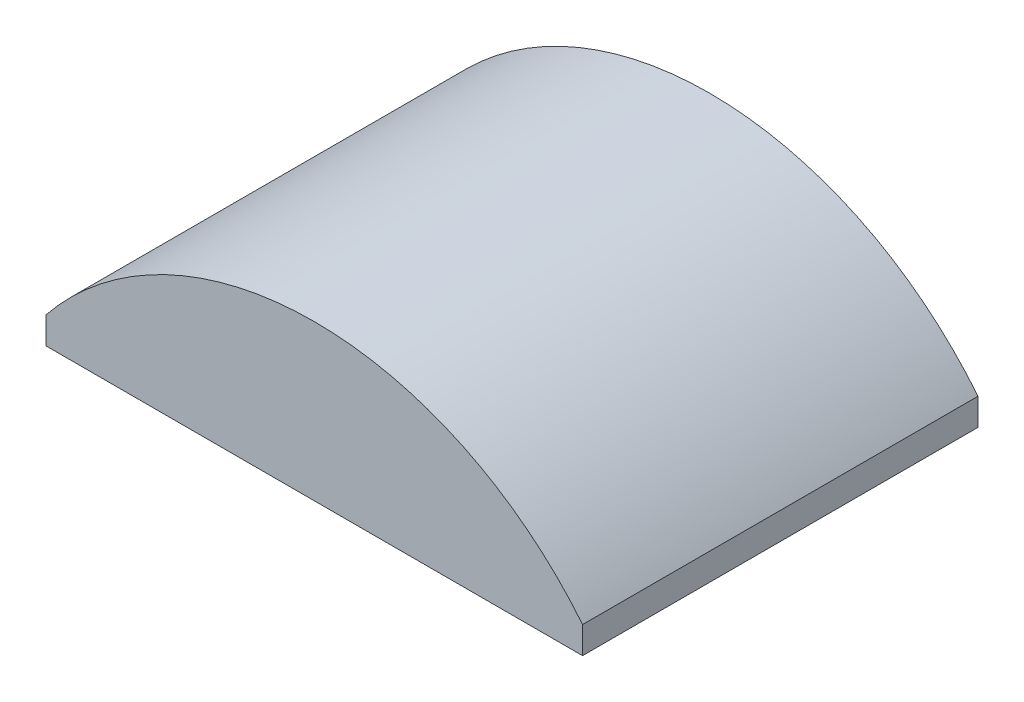
ISO-10303-21;
HEADER;
FILE_DESCRIPTION(('STEP AP214'),'2;1');
FILE_NAME('part.step','',(''),(''),'','','');
FILE_SCHEMA(('AUTOMOTIVE_DESIGN { 1 0 10303 214 1 1 1 1 }'));
ENDSEC;
DATA;
#1=APPLICATION_CONTEXT('core data for automotive mechanical design processes');
#2=APPLICATION_PROTOCOL_DEFINITION('international standard','automotive_design',2000,#1);
#3=PRODUCT_CONTEXT('',#1,'mechanical');
#4=PRODUCT('Part','Part','',(#3));
#5=PRODUCT_RELATED_PRODUCT_CATEGORY('part','',(#4));
#6=PRODUCT_DEFINITION_FORMATION('','',#4);
#7=PRODUCT_DEFINITION_CONTEXT('part definition',#1,'design');
#8=PRODUCT_DEFINITION('design','',#6,#7);
#9=PRODUCT_DEFINITION_SHAPE('','',#8);
#10=(LENGTH_UNIT() NAMED_UNIT(*) SI_UNIT(.MILLI.,.METRE.));
#11=(NAMED_UNIT(*) PLANE_ANGLE_UNIT() SI_UNIT($,.RADIAN.));
#12=(NAMED_UNIT(*) SI_UNIT($,.STERADIAN.) SOLID_ANGLE_UNIT());
#13=UNCERTAINTY_MEASURE_WITH_UNIT(LENGTH_MEASURE(1.E-05),#10,'distance_accuracy_value','');
#14=(GEOMETRIC_REPRESENTATION_CONTEXT(3) GLOBAL_UNCERTAINTY_ASSIGNED_CONTEXT((#13)) GLOBAL_UNIT_ASSIGNED_CONTEXT((#10,
#11,#12)) REPRESENTATION_CONTEXT('',''));
#15=CARTESIAN_POINT('',(0.,0.,0.));
#16=DIRECTION('',(0.,0.,1.));
#17=DIRECTION('',(1.,0.,0.));
#18=AXIS2_PLACEMENT_3D('',#15,#16,#17);
#19=CARTESIAN_POINT('',(8.83883476483183,-9.,30.8388347648319));
#20=DIRECTION('',(0.,-1.,0.));
#21=DIRECTION('',(1.,0.,0.));
#22=AXIS2_PLACEMENT_3D('',#19,#20,#21);
#23=PLANE('',#22);
#24=CARTESIAN_POINT('',(8.83883476483183,-9.,30.8388347648319));
#25=DIRECTION('',(0.,-1.,0.));
#26=DIRECTION('',(1.,0.,0.));
#27=AXIS2_PLACEMENT_3D('',#24,#25,#26);
#28=CIRCLE('',#27,3.5);
#29=CARTESIAN_POINT('',(12.3388347648318,-9.,30.8388347648319));
#30=VERTEX_POINT('',#29);
#31=EDGE_CURVE('E127',#30,#30,#28,.T.);
#32=ORIENTED_EDGE('',*,*,#31,.T.);
#33=EDGE_LOOP('',(#32));
#34=FACE_BOUND('',#33,.T.);
#35=CARTESIAN_POINT('',(8.83883476483183,-9.,30.8388347648319));
#36=DIRECTION('',(0.,-1.,0.));
#37=DIRECTION('',(1.,0.,0.));
#38=AXIS2_PLACEMENT_3D('',#35,#36,#37);
#39=CIRCLE('',#38,2.25);
#40=CARTESIAN_POINT('',(11.0888347648318,-9.,30.8388347648319));
#41=VERTEX_POINT('',#40);
#42=EDGE_CURVE('E320',#41,#41,#39,.T.);
#43=ORIENTED_EDGE('',*,*,#42,.F.);
#44=EDGE_LOOP('',(#43));
#45=FACE_BOUND('',#44,.T.);
#46=ADVANCED_FACE('F47',(#34,#45),#23,.T.);
#47=CARTESIAN_POINT('',(8.83883476483183,-9.,30.8388347648319));
#48=DIRECTION('',(0.,1.,0.));
#49=DIRECTION('',(-1.,0.,0.));
#50=AXIS2_PLACEMENT_3D('',#47,#48,#49);
#51=CYLINDRICAL_SURFACE('',#50,3.5);
#52=ORIENTED_EDGE('',*,*,#31,.F.);
#53=EDGE_LOOP('',(#52));
#54=FACE_BOUND('',#53,.T.);
#55=CARTESIAN_POINT('',(8.83883476483182,8.,30.8388347648319));
#56=DIRECTION('',(0.,-1.,0.));
#57=DIRECTION('',(1.,0.,0.));
#58=AXIS2_PLACEMENT_3D('',#55,#56,#57);
#59=CIRCLE('',#58,3.5);
#60=CARTESIAN_POINT('',(12.3388347648318,8.,30.8388347648319));
#61=VERTEX_POINT('',#60);
#62=EDGE_CURVE('E255',#61,#61,#59,.F.);
#63=ORIENTED_EDGE('',*,*,#62,.F.);
#64=EDGE_LOOP('',(#63));
#65=FACE_BOUND('',#64,.T.);
#66=ADVANCED_FACE('F185',(#54,#65),#51,.T.);
#67=CARTESIAN_POINT('',(8.83883476483183,-9.,30.8388347648319));
#68=DIRECTION('',(0.,1.,0.));
#69=DIRECTION('',(-1.,0.,0.));
#70=AXIS2_PLACEMENT_3D('',#67,#68,#69);
#71=CYLINDRICAL_SURFACE('',#70,2.25);
#72=ORIENTED_EDGE('',*,*,#42,.T.);
#73=EDGE_LOOP('',(#72));
#74=FACE_BOUND('',#73,.T.);
#75=CARTESIAN_POINT('',(8.83883476483183,0.,30.8388347648319));
#76=DIRECTION('',(0.,-1.,0.));
#77=DIRECTION('',(1.,0.,0.));
#78=AXIS2_PLACEMENT_3D('',#75,#76,#77);
#79=CIRCLE('',#78,2.25);
#80=CARTESIAN_POINT('',(11.0888347648318,0.,30.8388347648319));
#81=VERTEX_POINT('',#80);
#82=EDGE_CURVE('E294',#81,#81,#79,.T.);
#83=ORIENTED_EDGE('',*,*,#82,.F.);
#84=EDGE_LOOP('',(#83));
#85=FACE_BOUND('',#84,.T.);
#86=ADVANCED_FACE('F193',(#74,#85),#71,.F.);
#87=CARTESIAN_POINT('',(0.,0.,44.));
#88=DIRECTION('',(0.,1.,0.));
#89=DIRECTION('',(-1.,0.,0.));
#90=AXIS2_PLACEMENT_3D('',#87,#88,#89);
#91=PLANE('',#90);
#92=ORIENTED_EDGE('',*,*,#82,.T.);
#93=EDGE_LOOP('',(#92));
#94=FACE_BOUND('',#93,.T.);
#95=ADVANCED_FACE('F213',(#94),#91,.F.);
#96=CARTESIAN_POINT('',(8.83883476483182,8.,30.8388347648319));
#97=DIRECTION('',(0.,-1.,0.));
#98=DIRECTION('',(1.,0.,0.));
#99=AXIS2_PLACEMENT_3D('',#96,#97,#98);
#100=CYLINDRICAL_SURFACE('',#99,6.2);
#101=CARTESIAN_POINT('',(8.83883476483183,0.750000000000002,30.8388347648319));
#102=DIRECTION('',(0.,1.,0.));
#103=DIRECTION('',(0.,0.,1.));
#104=AXIS2_PLACEMENT_3D('',#101,#102,#103);
#105=CIRCLE('',#104,6.2);
#106=CARTESIAN_POINT('',(8.83883476483183,0.750000000000002,37.0388347648319));
#107=VERTEX_POINT('',#106);
#108=EDGE_CURVE('E160',#107,#107,#105,.F.);
#109=ORIENTED_EDGE('',*,*,#108,.T.);
#110=EDGE_LOOP('',(#109));
#111=FACE_BOUND('',#110,.T.);
#112=CARTESIAN_POINT('',(8.83883476483182,8.,30.8388347648319));
#113=DIRECTION('',(0.,-1.,0.));
#114=DIRECTION('',(1.,0.,0.));
#115=AXIS2_PLACEMENT_3D('',#112,#113,#114);
#116=CIRCLE('',#115,6.2);
#117=CARTESIAN_POINT('',(15.0388347648318,8.,30.8388347648319));
#118=VERTEX_POINT('',#117);
#119=EDGE_CURVE('E261',#118,#118,#116,.T.);
#120=ORIENTED_EDGE('',*,*,#119,.F.);
#121=EDGE_LOOP('',(#120));
#122=FACE_BOUND('',#121,.T.);
#123=ADVANCED_FACE('F333',(#111,#122),#100,.F.);
#124=CARTESIAN_POINT('',(0.,8.,0.));
#125=DIRECTION('',(0.,-1.,0.));
#126=DIRECTION('',(1.,0.,0.));
#127=AXIS2_PLACEMENT_3D('',#124,#125,#126);
#128=PLANE('',#127);
#129=ORIENTED_EDGE('',*,*,#62,.T.);
#130=EDGE_LOOP('',(#129));
#131=FACE_BOUND('',#130,.T.);
#132=ORIENTED_EDGE('',*,*,#119,.T.);
#133=EDGE_LOOP('',(#132));
#134=FACE_BOUND('',#133,.T.);
#135=ADVANCED_FACE('F219',(#131,#134),#128,.T.);
#136=CARTESIAN_POINT('',(0.,-21.0769599409892,44.));
#137=DIRECTION('',(0.,0.,-1.));
#138=DIRECTION('',(-1.,0.,0.));
#139=AXIS2_PLACEMENT_3D('',#136,#137,#138);
#140=CYLINDRICAL_SURFACE('',#139,38.35);
#141=CARTESIAN_POINT('',(0.,-21.0769599409892,0.));
#142=DIRECTION('',(0.,0.,1.));
#143=DIRECTION('',(1.,0.,0.));
#144=AXIS2_PLACEMENT_3D('',#141,#142,#143);
#145=CIRCLE('',#144,38.35);
#146=CARTESIAN_POINT('',(29.85,3.00000000000001,0.));
#147=VERTEX_POINT('',#146);
#148=CARTESIAN_POINT('',(-29.85,3.,0.));
#149=VERTEX_POINT('',#148);
#150=EDGE_CURVE('E123',#147,#149,#145,.T.);
#151=ORIENTED_EDGE('',*,*,#150,.T.);
#152=DIRECTION('',(0.,0.,-1.));
#153=VECTOR('',#152,1.);
#154=CARTESIAN_POINT('',(-29.85,3.,44.));
#155=LINE('',#154,#153);
#156=CARTESIAN_POINT('',(-29.85,3.,44.));
#157=VERTEX_POINT('',#156);
#158=EDGE_CURVE('E106',#157,#149,#155,.T.);
#159=ORIENTED_EDGE('',*,*,#158,.F.);
#160=CARTESIAN_POINT('',(0.,-21.0769599409892,44.));
#161=DIRECTION('',(0.,0.,1.));
#162=DIRECTION('',(1.,0.,0.));
#163=AXIS2_PLACEMENT_3D('',#160,#161,#162);
#164=CIRCLE('',#163,38.35);
#165=CARTESIAN_POINT('',(29.85,3.00000000000001,44.));
#166=VERTEX_POINT('',#165);
#167=EDGE_CURVE('E93',#166,#157,#164,.T.);
#168=ORIENTED_EDGE('',*,*,#167,.F.);
#169=DIRECTION('',(0.,0.,-1.));
#170=VECTOR('',#169,1.);
#171=CARTESIAN_POINT('',(29.85,3.00000000000001,44.));
#172=LINE('',#171,#170);
#173=EDGE_CURVE('E122',#166,#147,#172,.T.);
#174=ORIENTED_EDGE('',*,*,#173,.T.);
#175=EDGE_LOOP('',(#151,#159,#168,#174));
#176=FACE_BOUND('',#175,.T.);
#177=ADVANCED_FACE('F216',(#176),#140,.T.);
#178=CARTESIAN_POINT('',(-29.85,0.,44.));
#179=DIRECTION('',(-1.,0.,0.));
#180=DIRECTION('',(0.,0.,1.));
#181=AXIS2_PLACEMENT_3D('',#178,#179,#180);
#182=PLANE('',#181);
#183=DIRECTION('',(0.,1.,0.));
#184=VECTOR('',#183,1.);
#185=CARTESIAN_POINT('',(-29.85,0.,0.));
#186=LINE('',#185,#184);
#187=CARTESIAN_POINT('',(-29.85,0.,0.));
#188=VERTEX_POINT('',#187);
#189=EDGE_CURVE('E104',#188,#149,#186,.T.);
#190=ORIENTED_EDGE('',*,*,#189,.F.);
#191=DIRECTION('',(0.,0.,-1.));
#192=VECTOR('',#191,1.);
#193=CARTESIAN_POINT('',(-29.85,0.,44.));
#194=LINE('',#193,#192);
#195=CARTESIAN_POINT('',(-29.85,0.,44.));
#196=VERTEX_POINT('',#195);
#197=EDGE_CURVE('E99',#196,#188,#194,.T.);
#198=ORIENTED_EDGE('',*,*,#197,.F.);
#199=DIRECTION('',(0.,1.,0.));
#200=VECTOR('',#199,1.);
#201=CARTESIAN_POINT('',(-29.85,0.,44.));
#202=LINE('',#201,#200);
#203=EDGE_CURVE('E102',#196,#157,#202,.T.);
#204=ORIENTED_EDGE('',*,*,#203,.T.);
#205=ORIENTED_EDGE('',*,*,#158,.T.);
#206=EDGE_LOOP('',(#190,#198,#204,#205));
#207=FACE_BOUND('',#206,.T.);
#208=ADVANCED_FACE('F101',(#207),#182,.T.);
#209=CARTESIAN_POINT('',(0.,0.,44.));
#210=DIRECTION('',(0.,0.,1.));
#211=DIRECTION('',(1.,0.,0.));
#212=AXIS2_PLACEMENT_3D('',#209,#210,#211);
#213=PLANE('',#212);
#214=ORIENTED_EDGE('',*,*,#167,.T.);
#215=ORIENTED_EDGE('',*,*,#203,.F.);
#216=DIRECTION('',(1.,0.,0.));
#217=VECTOR('',#216,1.);
#218=CARTESIAN_POINT('',(0.,0.,44.));
#219=LINE('',#218,#217);
#220=CARTESIAN_POINT('',(29.85,0.,44.));
#221=VERTEX_POINT('',#220);
#222=EDGE_CURVE('E109',#196,#221,#219,.T.);
#223=ORIENTED_EDGE('',*,*,#222,.T.);
#224=DIRECTION('',(0.,1.,0.));
#225=VECTOR('',#224,1.);
#226=CARTESIAN_POINT('',(29.85,0.,44.));
#227=LINE('',#226,#225);
#228=EDGE_CURVE('E66',#221,#166,#227,.T.);
#229=ORIENTED_EDGE('',*,*,#228,.T.);
#230=EDGE_LOOP('',(#214,#215,#223,#229));
#231=FACE_BOUND('',#230,.T.);
#232=ADVANCED_FACE('F113',(#231),#213,.T.);
#233=CARTESIAN_POINT('',(29.85,0.,44.));
#234=DIRECTION('',(-1.,0.,0.));
#235=DIRECTION('',(0.,0.,1.));
#236=AXIS2_PLACEMENT_3D('',#233,#234,#235);
#237=PLANE('',#236);
#238=DIRECTION('',(0.,1.,0.));
#239=VECTOR('',#238,1.);
#240=CARTESIAN_POINT('',(29.85,0.,0.));
#241=LINE('',#240,#239);
#242=CARTESIAN_POINT('',(29.85,0.,0.));
#243=VERTEX_POINT('',#242);
#244=EDGE_CURVE('E88',#243,#147,#241,.T.);
#245=ORIENTED_EDGE('',*,*,#244,.T.);
#246=ORIENTED_EDGE('',*,*,#173,.F.);
#247=ORIENTED_EDGE('',*,*,#228,.F.);
#248=DIRECTION('',(0.,0.,-1.));
#249=VECTOR('',#248,1.);
#250=CARTESIAN_POINT('',(29.85,0.,44.));
#251=LINE('',#250,#249);
#252=EDGE_CURVE('E107',#221,#243,#251,.T.);
#253=ORIENTED_EDGE('',*,*,#252,.T.);
#254=EDGE_LOOP('',(#245,#246,#247,#253));
#255=FACE_BOUND('',#254,.T.);
#256=ADVANCED_FACE('F203',(#255),#237,.F.);
#257=CARTESIAN_POINT('',(0.,0.,0.));
#258=DIRECTION('',(0.,0.,1.));
#259=DIRECTION('',(1.,0.,0.));
#260=AXIS2_PLACEMENT_3D('',#257,#258,#259);
#261=PLANE('',#260);
#262=ORIENTED_EDGE('',*,*,#150,.F.);
#263=ORIENTED_EDGE('',*,*,#244,.F.);
#264=DIRECTION('',(1.,0.,0.));
#265=VECTOR('',#264,1.);
#266=CARTESIAN_POINT('',(0.,0.,0.));
#267=LINE('',#266,#265);
#268=EDGE_CURVE('E82',#188,#243,#267,.T.);
#269=ORIENTED_EDGE('',*,*,#268,.F.);
#270=ORIENTED_EDGE('',*,*,#189,.T.);
#271=EDGE_LOOP('',(#262,#263,#269,#270));
#272=FACE_BOUND('',#271,.T.);
#273=ADVANCED_FACE('F204',(#272),#261,.F.);
#274=CARTESIAN_POINT('',(8.83883476483186,0.,13.1611652351682));
#275=DIRECTION('',(0.,1.,0.));
#276=DIRECTION('',(-1.,0.,0.));
#277=AXIS2_PLACEMENT_3D('',#274,#275,#276);
#278=CIRCLE('',#277,6.94999999999998);
#279=CARTESIAN_POINT('',(1.88883476483188,0.,13.1611652351682));
#280=VERTEX_POINT('',#279);
#281=EDGE_CURVE('E156',#280,#280,#278,.T.);
#282=ORIENTED_EDGE('',*,*,#281,.T.);
#283=EDGE_LOOP('',(#282));
#284=FACE_BOUND('',#283,.T.);
#285=CARTESIAN_POINT('',(8.83883476483183,0.,30.8388347648319));
#286=DIRECTION('',(0.,1.,0.));
#287=DIRECTION('',(-1.,0.,0.));
#288=AXIS2_PLACEMENT_3D('',#285,#286,#287);
#289=CIRCLE('',#288,6.95);
#290=CARTESIAN_POINT('',(1.88883476483183,0.,30.8388347648319));
#291=VERTEX_POINT('',#290);
#292=EDGE_CURVE('E152',#291,#291,#289,.T.);
#293=ORIENTED_EDGE('',*,*,#292,.T.);
#294=EDGE_LOOP('',(#293));
#295=FACE_BOUND('',#294,.T.);
#296=CARTESIAN_POINT('',(-8.83883476483186,0.,30.8388347648318));
#297=DIRECTION('',(0.,1.,0.));
#298=DIRECTION('',(-1.,0.,0.));
#299=AXIS2_PLACEMENT_3D('',#296,#297,#298);
#300=CIRCLE('',#299,6.95);
#301=CARTESIAN_POINT('',(-15.7888347648319,0.,30.8388347648318));
#302=VERTEX_POINT('',#301);
#303=EDGE_CURVE('E148',#302,#302,#300,.T.);
#304=ORIENTED_EDGE('',*,*,#303,.T.);
#305=EDGE_LOOP('',(#304));
#306=FACE_BOUND('',#305,.T.);
#307=CARTESIAN_POINT('',(-8.83883476483163,0.,13.1611652351679));
#308=DIRECTION('',(0.,1.,0.));
#309=DIRECTION('',(-1.,0.,0.));
#310=AXIS2_PLACEMENT_3D('',#307,#308,#309);
#311=CIRCLE('',#310,6.95);
#312=CARTESIAN_POINT('',(-15.7888347648316,0.,13.1611652351679));
#313=VERTEX_POINT('',#312);
#314=EDGE_CURVE('E144',#313,#313,#311,.T.);
#315=ORIENTED_EDGE('',*,*,#314,.T.);
#316=EDGE_LOOP('',(#315));
#317=FACE_BOUND('',#316,.T.);
#318=ORIENTED_EDGE('',*,*,#268,.T.);
#319=ORIENTED_EDGE('',*,*,#252,.F.);
#320=ORIENTED_EDGE('',*,*,#222,.F.);
#321=ORIENTED_EDGE('',*,*,#197,.T.);
#322=EDGE_LOOP('',(#318,#319,#320,#321));
#323=FACE_BOUND('',#322,.T.);
#324=ADVANCED_FACE('F110',(#284,#295,#306,#317,#323),#91,.F.);
#325=CARTESIAN_POINT('',(-8.83883476483187,8.,30.8388347648318));
#326=DIRECTION('',(0.,-1.,0.));
#327=DIRECTION('',(1.,0.,0.));
#328=AXIS2_PLACEMENT_3D('',#325,#326,#327);
#329=CYLINDRICAL_SURFACE('',#328,6.2);
#330=CARTESIAN_POINT('',(-8.83883476483186,0.75,30.8388347648318));
#331=DIRECTION('',(0.,1.,0.));
#332=DIRECTION('',(0.,0.,1.));
#333=AXIS2_PLACEMENT_3D('',#330,#331,#332);
#334=CIRCLE('',#333,6.2);
#335=CARTESIAN_POINT('',(-8.83883476483186,0.75,37.0388347648318));
#336=VERTEX_POINT('',#335);
#337=EDGE_CURVE('E58',#336,#336,#334,.F.);
#338=ORIENTED_EDGE('',*,*,#337,.T.);
#339=EDGE_LOOP('',(#338));
#340=FACE_BOUND('',#339,.T.);
#341=CARTESIAN_POINT('',(-8.83883476483187,8.,30.8388347648318));
#342=DIRECTION('',(0.,-1.,0.));
#343=DIRECTION('',(1.,0.,0.));
#344=AXIS2_PLACEMENT_3D('',#341,#342,#343);
#345=CIRCLE('',#344,6.2);
#346=CARTESIAN_POINT('',(-2.63883476483187,8.,30.8388347648318));
#347=VERTEX_POINT('',#346);
#348=EDGE_CURVE('E279',#347,#347,#345,.T.);
#349=ORIENTED_EDGE('',*,*,#348,.F.);
#350=EDGE_LOOP('',(#349));
#351=FACE_BOUND('',#350,.T.);
#352=ADVANCED_FACE('F167',(#340,#351),#329,.F.);
#353=CARTESIAN_POINT('',(0.,8.,0.));
#354=DIRECTION('',(0.,-1.,0.));
#355=DIRECTION('',(1.,0.,0.));
#356=AXIS2_PLACEMENT_3D('',#353,#354,#355);
#357=PLANE('',#356);
#358=CARTESIAN_POINT('',(-8.83883476483187,8.,30.8388347648318));
#359=DIRECTION('',(0.,-1.,0.));
#360=DIRECTION('',(1.,0.,0.));
#361=AXIS2_PLACEMENT_3D('',#358,#359,#360);
#362=CIRCLE('',#361,3.49999999999982);
#363=CARTESIAN_POINT('',(-5.33883476483205,8.,30.8388347648318));
#364=VERTEX_POINT('',#363);
#365=EDGE_CURVE('E275',#364,#364,#362,.F.);
#366=ORIENTED_EDGE('',*,*,#365,.T.);
#367=EDGE_LOOP('',(#366));
#368=FACE_BOUND('',#367,.T.);
#369=ORIENTED_EDGE('',*,*,#348,.T.);
#370=EDGE_LOOP('',(#369));
#371=FACE_BOUND('',#370,.T.);
#372=ADVANCED_FACE('F357',(#368,#371),#357,.T.);
#373=CARTESIAN_POINT('',(-8.83883476483163,8.,13.1611652351679));
#374=DIRECTION('',(0.,-1.,0.));
#375=DIRECTION('',(1.,0.,0.));
#376=AXIS2_PLACEMENT_3D('',#373,#374,#375);
#377=CYLINDRICAL_SURFACE('',#376,6.2);
#378=CARTESIAN_POINT('',(-8.83883476483163,0.750000000000022,13.1611652351679));
#379=DIRECTION('',(0.,1.,0.));
#380=DIRECTION('',(0.,0.,1.));
#381=AXIS2_PLACEMENT_3D('',#378,#379,#380);
#382=CIRCLE('',#381,6.2);
#383=CARTESIAN_POINT('',(-8.83883476483163,0.750000000000022,19.361165235168));
#384=VERTEX_POINT('',#383);
#385=EDGE_CURVE('E11',#384,#384,#382,.F.);
#386=ORIENTED_EDGE('',*,*,#385,.T.);
#387=EDGE_LOOP('',(#386));
#388=FACE_BOUND('',#387,.T.);
#389=CARTESIAN_POINT('',(-8.83883476483163,8.,13.1611652351679));
#390=DIRECTION('',(0.,-1.,0.));
#391=DIRECTION('',(1.,0.,0.));
#392=AXIS2_PLACEMENT_3D('',#389,#390,#391);
#393=CIRCLE('',#392,6.2);
#394=CARTESIAN_POINT('',(-2.63883476483163,8.,13.1611652351679));
#395=VERTEX_POINT('',#394);
#396=EDGE_CURVE('E264',#395,#395,#393,.T.);
#397=ORIENTED_EDGE('',*,*,#396,.F.);
#398=EDGE_LOOP('',(#397));
#399=FACE_BOUND('',#398,.T.);
#400=ADVANCED_FACE('F353',(#388,#399),#377,.F.);
#401=CARTESIAN_POINT('',(0.,8.,0.));
#402=DIRECTION('',(0.,-1.,0.));
#403=DIRECTION('',(1.,0.,0.));
#404=AXIS2_PLACEMENT_3D('',#401,#402,#403);
#405=PLANE('',#404);
#406=CARTESIAN_POINT('',(-8.83883476483163,8.,13.1611652351679));
#407=DIRECTION('',(0.,-1.,0.));
#408=DIRECTION('',(1.,0.,0.));
#409=AXIS2_PLACEMENT_3D('',#406,#407,#408);
#410=CIRCLE('',#409,3.5);
#411=CARTESIAN_POINT('',(-5.33883476483163,8.,13.1611652351679));
#412=VERTEX_POINT('',#411);
#413=EDGE_CURVE('E268',#412,#412,#410,.F.);
#414=ORIENTED_EDGE('',*,*,#413,.T.);
#415=EDGE_LOOP('',(#414));
#416=FACE_BOUND('',#415,.T.);
#417=ORIENTED_EDGE('',*,*,#396,.T.);
#418=EDGE_LOOP('',(#417));
#419=FACE_BOUND('',#418,.T.);
#420=ADVANCED_FACE('F248',(#416,#419),#405,.T.);
#421=CARTESIAN_POINT('',(8.83883476483186,8.,13.1611652351682));
#422=DIRECTION('',(0.,-1.,0.));
#423=DIRECTION('',(1.,0.,0.));
#424=AXIS2_PLACEMENT_3D('',#421,#422,#423);
#425=CYLINDRICAL_SURFACE('',#424,6.2);
#426=CARTESIAN_POINT('',(8.83883476483186,0.749999999999989,13.1611652351682));
#427=DIRECTION('',(0.,1.,0.));
#428=DIRECTION('',(0.,0.,1.));
#429=AXIS2_PLACEMENT_3D('',#426,#427,#428);
#430=CIRCLE('',#429,6.2);
#431=CARTESIAN_POINT('',(8.83883476483186,0.749999999999989,19.3611652351682));
#432=VERTEX_POINT('',#431);
#433=EDGE_CURVE('E140',#432,#432,#430,.F.);
#434=ORIENTED_EDGE('',*,*,#433,.T.);
#435=EDGE_LOOP('',(#434));
#436=FACE_BOUND('',#435,.T.);
#437=CARTESIAN_POINT('',(8.83883476483186,8.,13.1611652351682));
#438=DIRECTION('',(0.,-1.,0.));
#439=DIRECTION('',(1.,0.,0.));
#440=AXIS2_PLACEMENT_3D('',#437,#438,#439);
#441=CIRCLE('',#440,6.2);
#442=CARTESIAN_POINT('',(15.0388347648319,8.,13.1611652351682));
#443=VERTEX_POINT('',#442);
#444=EDGE_CURVE('E252',#443,#443,#441,.T.);
#445=ORIENTED_EDGE('',*,*,#444,.F.);
#446=EDGE_LOOP('',(#445));
#447=FACE_BOUND('',#446,.T.);
#448=ADVANCED_FACE('F245',(#436,#447),#425,.F.);
#449=CARTESIAN_POINT('',(0.,8.,0.));
#450=DIRECTION('',(0.,-1.,0.));
#451=DIRECTION('',(1.,0.,0.));
#452=AXIS2_PLACEMENT_3D('',#449,#450,#451);
#453=PLANE('',#452);
#454=CARTESIAN_POINT('',(8.83883476483186,8.,13.1611652351682));
#455=DIRECTION('',(0.,-1.,0.));
#456=DIRECTION('',(1.,0.,0.));
#457=AXIS2_PLACEMENT_3D('',#454,#455,#456);
#458=CIRCLE('',#457,3.50000000000009);
#459=CARTESIAN_POINT('',(12.3388347648319,8.,13.1611652351682));
#460=VERTEX_POINT('',#459);
#461=EDGE_CURVE('E256',#460,#460,#458,.F.);
#462=ORIENTED_EDGE('',*,*,#461,.T.);
#463=EDGE_LOOP('',(#462));
#464=FACE_BOUND('',#463,.T.);
#465=ORIENTED_EDGE('',*,*,#444,.T.);
#466=EDGE_LOOP('',(#465));
#467=FACE_BOUND('',#466,.T.);
#468=ADVANCED_FACE('F247',(#464,#467),#453,.T.);
#469=CARTESIAN_POINT('',(-8.83883476483186,0.,30.8388347648318));
#470=DIRECTION('',(0.,-1.,0.));
#471=DIRECTION('',(1.,0.,0.));
#472=AXIS2_PLACEMENT_3D('',#469,#470,#471);
#473=CIRCLE('',#472,2.24999999999981);
#474=CARTESIAN_POINT('',(-6.58883476483205,0.,30.8388347648318));
#475=VERTEX_POINT('',#474);
#476=EDGE_CURVE('E303',#475,#475,#473,.T.);
#477=ORIENTED_EDGE('',*,*,#476,.T.);
#478=EDGE_LOOP('',(#477));
#479=FACE_BOUND('',#478,.T.);
#480=ADVANCED_FACE('F212',(#479),#91,.F.);
#481=CARTESIAN_POINT('',(-8.83883476483186,-9.,30.8388347648318));
#482=DIRECTION('',(0.,1.,0.));
#483=DIRECTION('',(-1.,0.,0.));
#484=AXIS2_PLACEMENT_3D('',#481,#482,#483);
#485=CYLINDRICAL_SURFACE('',#484,2.24999999999981);
#486=CARTESIAN_POINT('',(-8.83883476483186,-9.,30.8388347648318));
#487=DIRECTION('',(0.,-1.,0.));
#488=DIRECTION('',(1.,0.,0.));
#489=AXIS2_PLACEMENT_3D('',#486,#487,#488);
#490=CIRCLE('',#489,2.24999999999981);
#491=CARTESIAN_POINT('',(-6.58883476483205,-9.,30.8388347648318));
#492=VERTEX_POINT('',#491);
#493=EDGE_CURVE('E313',#492,#492,#490,.T.);
#494=ORIENTED_EDGE('',*,*,#493,.T.);
#495=EDGE_LOOP('',(#494));
#496=FACE_BOUND('',#495,.T.);
#497=ORIENTED_EDGE('',*,*,#476,.F.);
#498=EDGE_LOOP('',(#497));
#499=FACE_BOUND('',#498,.T.);
#500=ADVANCED_FACE('F390',(#496,#499),#485,.F.);
#501=CARTESIAN_POINT('',(-8.83883476483186,-9.,30.8388347648318));
#502=DIRECTION('',(0.,-1.,0.));
#503=DIRECTION('',(1.,0.,0.));
#504=AXIS2_PLACEMENT_3D('',#501,#502,#503);
#505=PLANE('',#504);
#506=CARTESIAN_POINT('',(-8.83883476483186,-9.,30.8388347648318));
#507=DIRECTION('',(0.,-1.,0.));
#508=DIRECTION('',(1.,0.,0.));
#509=AXIS2_PLACEMENT_3D('',#506,#507,#508);
#510=CIRCLE('',#509,3.49999999999982);
#511=CARTESIAN_POINT('',(-5.33883476483205,-9.,30.8388347648318));
#512=VERTEX_POINT('',#511);
#513=EDGE_CURVE('E283',#512,#512,#510,.T.);
#514=ORIENTED_EDGE('',*,*,#513,.T.);
#515=EDGE_LOOP('',(#514));
#516=FACE_BOUND('',#515,.T.);
#517=ORIENTED_EDGE('',*,*,#493,.F.);
#518=EDGE_LOOP('',(#517));
#519=FACE_BOUND('',#518,.T.);
#520=ADVANCED_FACE('F387',(#516,#519),#505,.T.);
#521=CARTESIAN_POINT('',(-8.83883476483186,-9.,30.8388347648318));
#522=DIRECTION('',(0.,1.,0.));
#523=DIRECTION('',(-1.,0.,0.));
#524=AXIS2_PLACEMENT_3D('',#521,#522,#523);
#525=CYLINDRICAL_SURFACE('',#524,3.49999999999982);
#526=ORIENTED_EDGE('',*,*,#513,.F.);
#527=EDGE_LOOP('',(#526));
#528=FACE_BOUND('',#527,.T.);
#529=ORIENTED_EDGE('',*,*,#365,.F.);
#530=EDGE_LOOP('',(#529));
#531=FACE_BOUND('',#530,.T.);
#532=ADVANCED_FACE('F384',(#528,#531),#525,.T.);
#533=CARTESIAN_POINT('',(-8.83883476483163,0.,13.1611652351679));
#534=DIRECTION('',(0.,-1.,0.));
#535=DIRECTION('',(1.,0.,0.));
#536=AXIS2_PLACEMENT_3D('',#533,#534,#535);
#537=CIRCLE('',#536,2.25);
#538=CARTESIAN_POINT('',(-6.58883476483163,0.,13.1611652351679));
#539=VERTEX_POINT('',#538);
#540=EDGE_CURVE('E289',#539,#539,#537,.T.);
#541=ORIENTED_EDGE('',*,*,#540,.T.);
#542=EDGE_LOOP('',(#541));
#543=FACE_BOUND('',#542,.T.);
#544=ADVANCED_FACE('F382',(#543),#91,.F.);
#545=CARTESIAN_POINT('',(-8.83883476483163,-9.,13.1611652351679));
#546=DIRECTION('',(0.,1.,0.));
#547=DIRECTION('',(-1.,0.,0.));
#548=AXIS2_PLACEMENT_3D('',#545,#546,#547);
#549=CYLINDRICAL_SURFACE('',#548,2.25);
#550=CARTESIAN_POINT('',(-8.83883476483163,-9.,13.1611652351679));
#551=DIRECTION('',(0.,-1.,0.));
#552=DIRECTION('',(1.,0.,0.));
#553=AXIS2_PLACEMENT_3D('',#550,#551,#552);
#554=CIRCLE('',#553,2.25);
#555=CARTESIAN_POINT('',(-6.58883476483163,-9.,13.1611652351679));
#556=VERTEX_POINT('',#555);
#557=EDGE_CURVE('E302',#556,#556,#554,.T.);
#558=ORIENTED_EDGE('',*,*,#557,.T.);
#559=EDGE_LOOP('',(#558));
#560=FACE_BOUND('',#559,.T.);
#561=ORIENTED_EDGE('',*,*,#540,.F.);
#562=EDGE_LOOP('',(#561));
#563=FACE_BOUND('',#562,.T.);
#564=ADVANCED_FACE('F378',(#560,#563),#549,.F.);
#565=CARTESIAN_POINT('',(-8.83883476483163,-9.,13.1611652351679));
#566=DIRECTION('',(0.,-1.,0.));
#567=DIRECTION('',(1.,0.,0.));
#568=AXIS2_PLACEMENT_3D('',#565,#566,#567);
#569=PLANE('',#568);
#570=CARTESIAN_POINT('',(-8.83883476483163,-9.,13.1611652351679));
#571=DIRECTION('',(0.,-1.,0.));
#572=DIRECTION('',(1.,0.,0.));
#573=AXIS2_PLACEMENT_3D('',#570,#571,#572);
#574=CIRCLE('',#573,3.5);
#575=CARTESIAN_POINT('',(-5.33883476483162,-9.,13.1611652351679));
#576=VERTEX_POINT('',#575);
#577=EDGE_CURVE('E298',#576,#576,#574,.T.);
#578=ORIENTED_EDGE('',*,*,#577,.T.);
#579=EDGE_LOOP('',(#578));
#580=FACE_BOUND('',#579,.T.);
#581=ORIENTED_EDGE('',*,*,#557,.F.);
#582=EDGE_LOOP('',(#581));
#583=FACE_BOUND('',#582,.T.);
#584=ADVANCED_FACE('F374',(#580,#583),#569,.T.);
#585=CARTESIAN_POINT('',(-8.83883476483163,-9.,13.1611652351679));
#586=DIRECTION('',(0.,1.,0.));
#587=DIRECTION('',(-1.,0.,0.));
#588=AXIS2_PLACEMENT_3D('',#585,#586,#587);
#589=CYLINDRICAL_SURFACE('',#588,3.5);
#590=ORIENTED_EDGE('',*,*,#577,.F.);
#591=EDGE_LOOP('',(#590));
#592=FACE_BOUND('',#591,.T.);
#593=ORIENTED_EDGE('',*,*,#413,.F.);
#594=EDGE_LOOP('',(#593));
#595=FACE_BOUND('',#594,.T.);
#596=ADVANCED_FACE('F371',(#592,#595),#589,.T.);
#597=CARTESIAN_POINT('',(8.83883476483186,0.,13.1611652351682));
#598=DIRECTION('',(0.,-1.,0.));
#599=DIRECTION('',(1.,0.,0.));
#600=AXIS2_PLACEMENT_3D('',#597,#598,#599);
#601=CIRCLE('',#600,2.25000000000008);
#602=CARTESIAN_POINT('',(11.0888347648319,0.,13.1611652351682));
#603=VERTEX_POINT('',#602);
#604=EDGE_CURVE('E290',#603,#603,#601,.T.);
#605=ORIENTED_EDGE('',*,*,#604,.T.);
#606=EDGE_LOOP('',(#605));
#607=FACE_BOUND('',#606,.T.);
#608=ADVANCED_FACE('F346',(#607),#91,.F.);
#609=CARTESIAN_POINT('',(8.83883476483186,-9.,13.1611652351682));
#610=DIRECTION('',(0.,1.,0.));
#611=DIRECTION('',(-1.,0.,0.));
#612=AXIS2_PLACEMENT_3D('',#609,#610,#611);
#613=CYLINDRICAL_SURFACE('',#612,2.25000000000008);
#614=CARTESIAN_POINT('',(8.83883476483186,-9.,13.1611652351682));
#615=DIRECTION('',(0.,-1.,0.));
#616=DIRECTION('',(1.,0.,0.));
#617=AXIS2_PLACEMENT_3D('',#614,#615,#616);
#618=CIRCLE('',#617,2.25000000000008);
#619=CARTESIAN_POINT('',(11.0888347648319,-9.,13.1611652351682));
#620=VERTEX_POINT('',#619);
#621=EDGE_CURVE('E288',#620,#620,#618,.T.);
#622=ORIENTED_EDGE('',*,*,#621,.T.);
#623=EDGE_LOOP('',(#622));
#624=FACE_BOUND('',#623,.T.);
#625=ORIENTED_EDGE('',*,*,#604,.F.);
#626=EDGE_LOOP('',(#625));
#627=FACE_BOUND('',#626,.T.);
#628=ADVANCED_FACE('F366',(#624,#627),#613,.F.);
#629=CARTESIAN_POINT('',(8.83883476483186,-9.,13.1611652351682));
#630=DIRECTION('',(0.,-1.,0.));
#631=DIRECTION('',(1.,0.,0.));
#632=AXIS2_PLACEMENT_3D('',#629,#630,#631);
#633=PLANE('',#632);
#634=CARTESIAN_POINT('',(8.83883476483186,-9.,13.1611652351682));
#635=DIRECTION('',(0.,-1.,0.));
#636=DIRECTION('',(1.,0.,0.));
#637=AXIS2_PLACEMENT_3D('',#634,#635,#636);
#638=CIRCLE('',#637,3.50000000000009);
#639=CARTESIAN_POINT('',(12.3388347648319,-9.,13.1611652351682));
#640=VERTEX_POINT('',#639);
#641=EDGE_CURVE('E284',#640,#640,#638,.T.);
#642=ORIENTED_EDGE('',*,*,#641,.T.);
#643=EDGE_LOOP('',(#642));
#644=FACE_BOUND('',#643,.T.);
#645=ORIENTED_EDGE('',*,*,#621,.F.);
#646=EDGE_LOOP('',(#645));
#647=FACE_BOUND('',#646,.T.);
#648=ADVANCED_FACE('F238',(#644,#647),#633,.T.);
#649=CARTESIAN_POINT('',(8.83883476483186,-9.,13.1611652351682));
#650=DIRECTION('',(0.,1.,0.));
#651=DIRECTION('',(-1.,0.,0.));
#652=AXIS2_PLACEMENT_3D('',#649,#650,#651);
#653=CYLINDRICAL_SURFACE('',#652,3.50000000000009);
#654=ORIENTED_EDGE('',*,*,#641,.F.);
#655=EDGE_LOOP('',(#654));
#656=FACE_BOUND('',#655,.T.);
#657=ORIENTED_EDGE('',*,*,#461,.F.);
#658=EDGE_LOOP('',(#657));
#659=FACE_BOUND('',#658,.T.);
#660=ADVANCED_FACE('F226',(#656,#659),#653,.T.);
#661=CARTESIAN_POINT('',(8.83883476483186,0.749999999999989,13.1611652351682));
#662=DIRECTION('',(0.,-1.,0.));
#663=DIRECTION('',(0.,0.,-1.));
#664=AXIS2_PLACEMENT_3D('',#661,#662,#663);
#665=CONICAL_SURFACE('',#664,6.2,0.78539816339745);
#666=ORIENTED_EDGE('',*,*,#281,.F.);
#667=EDGE_LOOP('',(#666));
#668=FACE_BOUND('',#667,.T.);
#669=ORIENTED_EDGE('',*,*,#433,.F.);
#670=EDGE_LOOP('',(#669));
#671=FACE_BOUND('',#670,.T.);
#672=ADVANCED_FACE('F179',(#668,#671),#665,.F.);
#673=CARTESIAN_POINT('',(8.83883476483183,0.750000000000002,30.8388347648319));
#674=DIRECTION('',(0.,-1.,0.));
#675=DIRECTION('',(0.,0.,-1.));
#676=AXIS2_PLACEMENT_3D('',#673,#674,#675);
#677=CONICAL_SURFACE('',#676,6.2,0.785398163397449);
#678=ORIENTED_EDGE('',*,*,#292,.F.);
#679=EDGE_LOOP('',(#678));
#680=FACE_BOUND('',#679,.T.);
#681=ORIENTED_EDGE('',*,*,#108,.F.);
#682=EDGE_LOOP('',(#681));
#683=FACE_BOUND('',#682,.T.);
#684=ADVANCED_FACE('F172',(#680,#683),#677,.F.);
#685=CARTESIAN_POINT('',(-8.83883476483186,0.75,30.8388347648318));
#686=DIRECTION('',(0.,-1.,0.));
#687=DIRECTION('',(0.,0.,-1.));
#688=AXIS2_PLACEMENT_3D('',#685,#686,#687);
#689=CONICAL_SURFACE('',#688,6.2,0.785398163397449);
#690=ORIENTED_EDGE('',*,*,#303,.F.);
#691=EDGE_LOOP('',(#690));
#692=FACE_BOUND('',#691,.T.);
#693=ORIENTED_EDGE('',*,*,#337,.F.);
#694=EDGE_LOOP('',(#693));
#695=FACE_BOUND('',#694,.T.);
#696=ADVANCED_FACE('F170',(#692,#695),#689,.F.);
#697=CARTESIAN_POINT('',(-8.83883476483163,0.750000000000022,13.1611652351679));
#698=DIRECTION('',(0.,-1.,0.));
#699=DIRECTION('',(0.,0.,-1.));
#700=AXIS2_PLACEMENT_3D('',#697,#698,#699);
#701=CONICAL_SURFACE('',#700,6.2,0.785398163397439);
#702=ORIENTED_EDGE('',*,*,#314,.F.);
#703=EDGE_LOOP('',(#702));
#704=FACE_BOUND('',#703,.T.);
#705=ORIENTED_EDGE('',*,*,#385,.F.);
#706=EDGE_LOOP('',(#705));
#707=FACE_BOUND('',#706,.T.);
#708=ADVANCED_FACE('F50',(#704,#707),#701,.F.);
#709=CLOSED_SHELL('',(#46,#66,#86,#95,#123,#135,#177,#208,#232,#256,#273,#324,#352,#372,#400,
#420,#448,#468,#480,#500,#520,#532,#544,#564,#584,#596,#608,#628,#648,#660,#672,#684,#696,#708));
#710=MANIFOLD_SOLID_BREP('B2',#709);
#711=ADVANCED_BREP_SHAPE_REPRESENTATION('',(#18,#710),#14);
#712=SHAPE_DEFINITION_REPRESENTATION(#9,#711);
ENDSEC;
END-ISO-10303-21;
